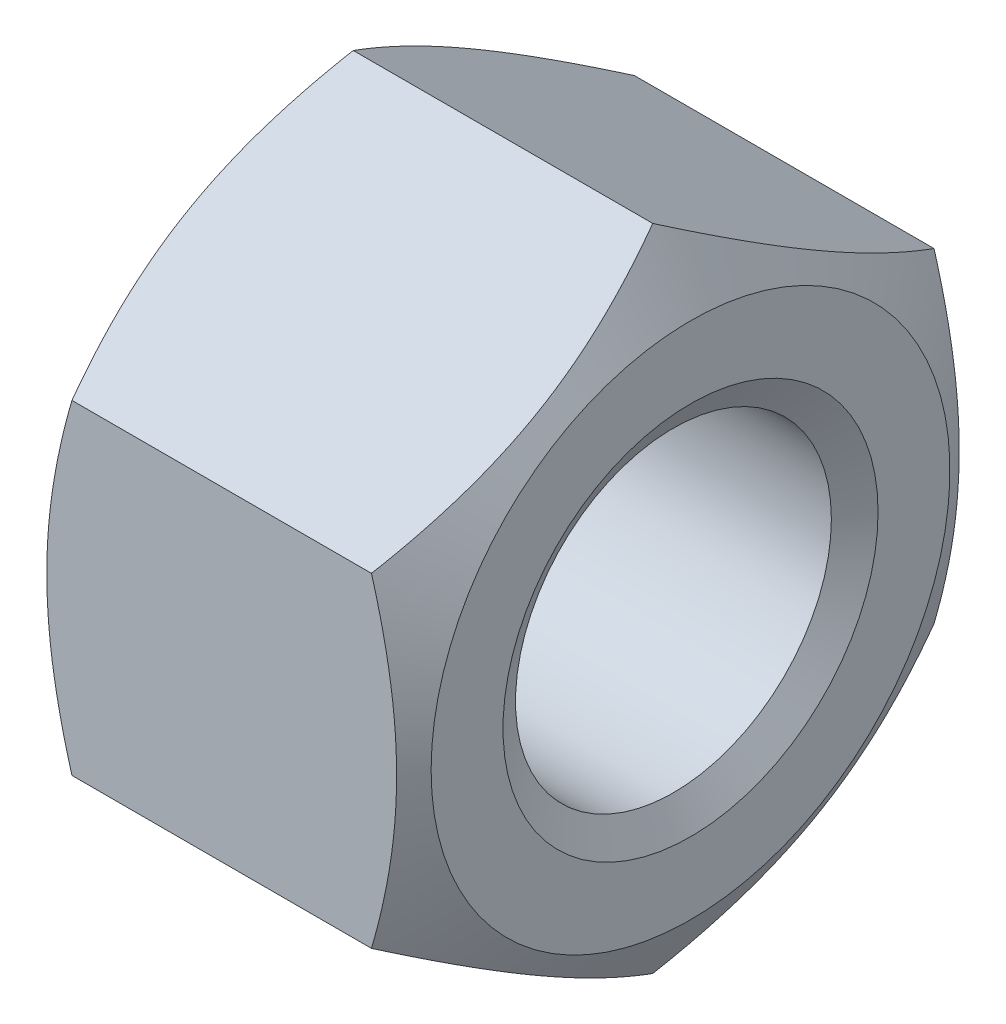
ISO-10303-21;
HEADER;
FILE_DESCRIPTION(('STEP AP214'),'2;1');
FILE_NAME('part.step','',(''),(''),'','','');
FILE_SCHEMA(('AUTOMOTIVE_DESIGN { 1 0 10303 214 1 1 1 1 }'));
ENDSEC;
DATA;
#1=APPLICATION_CONTEXT('core data for automotive mechanical design processes');
#2=APPLICATION_PROTOCOL_DEFINITION('international standard','automotive_design',2000,#1);
#3=PRODUCT_CONTEXT('',#1,'mechanical');
#4=PRODUCT('Part','Part','',(#3));
#5=PRODUCT_RELATED_PRODUCT_CATEGORY('part','',(#4));
#6=PRODUCT_DEFINITION_FORMATION('','',#4);
#7=PRODUCT_DEFINITION_CONTEXT('part definition',#1,'design');
#8=PRODUCT_DEFINITION('design','',#6,#7);
#9=PRODUCT_DEFINITION_SHAPE('','',#8);
#10=(LENGTH_UNIT() NAMED_UNIT(*) SI_UNIT(.MILLI.,.METRE.));
#11=(NAMED_UNIT(*) PLANE_ANGLE_UNIT() SI_UNIT($,.RADIAN.));
#12=(NAMED_UNIT(*) SI_UNIT($,.STERADIAN.) SOLID_ANGLE_UNIT());
#13=UNCERTAINTY_MEASURE_WITH_UNIT(LENGTH_MEASURE(1.E-05),#10,'distance_accuracy_value','');
#14=(GEOMETRIC_REPRESENTATION_CONTEXT(3) GLOBAL_UNCERTAINTY_ASSIGNED_CONTEXT((#13)) GLOBAL_UNIT_ASSIGNED_CONTEXT((#10,
#11,#12)) REPRESENTATION_CONTEXT('',''));
#15=CARTESIAN_POINT('',(0.,0.,0.));
#16=DIRECTION('',(0.,0.,1.));
#17=DIRECTION('',(1.,0.,0.));
#18=AXIS2_PLACEMENT_3D('',#15,#16,#17);
#19=CARTESIAN_POINT('',(0.,-5.19615242270663,9.));
#20=DIRECTION('',(0.,0.,1.));
#21=DIRECTION('',(1.,0.,0.));
#22=AXIS2_PLACEMENT_3D('',#19,#20,#21);
#23=PLANE('',#22);
#24=CARTESIAN_POINT('',(10.7920072006407,5.19615244908284,8.99999996280755));
#25=CARTESIAN_POINT('',(10.8579367021205,4.96774649350098,8.9999999866398));
#26=CARTESIAN_POINT('',(10.9208744760254,4.73844967700771,8.99999999641917));
#27=CARTESIAN_POINT('',(11.0399411197966,4.27799396747798,9.00000000358237));
#28=CARTESIAN_POINT('',(11.0960670506353,4.04683431625193,9.00000000096087));
#29=CARTESIAN_POINT('',(11.2007491843032,3.58222407504139,8.99999999903686));
#30=CARTESIAN_POINT('',(11.2492872997138,3.34876937968299,8.99999999974216));
#31=CARTESIAN_POINT('',(11.337743344119,2.88027225541252,9.00000000025777));
#32=CARTESIAN_POINT('',(11.3776630341332,2.6452301609984,9.00000000006827));
#33=CARTESIAN_POINT('',(11.4471978692115,2.17951731166322,8.9999999999334));
#34=CARTESIAN_POINT('',(11.4770419920115,1.94888095311327,8.99999999998215));
#35=CARTESIAN_POINT('',(11.5270801162313,1.48657638278532,9.00000000001784));
#36=CARTESIAN_POINT('',(11.5472749702592,1.25490826399993,9.00000000000477));
#37=CARTESIAN_POINT('',(11.5775101246048,0.791170290792557,8.99999999999523));
#38=CARTESIAN_POINT('',(11.5875619477008,0.559101192927458,8.99999999999872));
#39=CARTESIAN_POINT('',(11.5972935688812,0.0947495491293795,9.00000000000127));
#40=CARTESIAN_POINT('',(11.5969736875073,-0.137532989985249,9.00000000000031));
#41=CARTESIAN_POINT('',(11.5866846794573,-0.571777162862449,8.99999999999972));
#42=CARTESIAN_POINT('',(11.577970648293,-0.773769446121166,8.99999999999992));
#43=CARTESIAN_POINT('',(11.5528689081992,-1.17728085842589,9.00000000000007));
#44=CARTESIAN_POINT('',(11.5364806821399,-1.37879995466608,9.00000000000002));
#45=CARTESIAN_POINT('',(11.4761920643437,-1.98257705214849,8.99999999999994));
#46=CARTESIAN_POINT('',(11.421175262668,-2.38376637535587,8.99999999999998));
#47=CARTESIAN_POINT('',(11.2836351513656,-3.19040010074397,9.00000000000001));
#48=CARTESIAN_POINT('',(11.2005289331518,-3.5957415794054,9.00000000000001));
#49=CARTESIAN_POINT('',(11.0119132505929,-4.40038055523603,8.99999999999999));
#50=CARTESIAN_POINT('',(10.9064480744569,-4.79968835292957,8.99999999999998));
#51=CARTESIAN_POINT('',(10.7920072577196,-5.19615233570631,9.));
#52=B_SPLINE_CURVE_WITH_KNOTS('',3,(#24,#25,#26,#27,#28,#29,#30,#31,#32,#33,#34,#35,#36,#37,#38,
#39,#40,#41,#42,#43,#44,#45,#46,#47,#48,#49,#50,#51),.UNSPECIFIED.,.F.,.F.,(4,2,2,2,2,2,2,2,2,2,
2,2,2,4),(0.,0.713211353556727,1.42672934244264,2.14192306043958,2.85697050292028,
3.55445831583902,4.25188448742953,4.94851746757656,5.64512891802083,6.25151818008027,
6.85794830989732,8.07167213792062,9.31231054455676,10.5505141021013),.UNSPECIFIED.);
#53=CARTESIAN_POINT('',(10.7920072451693,5.19615244446898,8.9999999623065));
#54=VERTEX_POINT('',#53);
#55=CARTESIAN_POINT('',(10.7920072451693,-5.19615237918194,9.));
#56=VERTEX_POINT('',#55);
#57=EDGE_CURVE('E92',#54,#56,#52,.T.);
#58=ORIENTED_EDGE('',*,*,#57,.F.);
#59=DIRECTION('',(1.,0.,0.));
#60=VECTOR('',#59,1.);
#61=CARTESIAN_POINT('',(0.,5.19615242270663,8.99999999999999));
#62=LINE('',#61,#60);
#63=CARTESIAN_POINT('',(1.2079927548307,5.19615237918194,8.99999999999999));
#64=VERTEX_POINT('',#63);
#65=EDGE_CURVE('E80',#64,#54,#62,.T.);
#66=ORIENTED_EDGE('',*,*,#65,.F.);
#67=CARTESIAN_POINT('',(1.20799274207979,-5.19615233571104,9.00000000030846));
#68=CARTESIAN_POINT('',(1.14206325693808,-4.96774637828837,9.0000000001108));
#69=CARTESIAN_POINT('',(1.07912549077972,-4.73844956232251,9.00000000002969));
#70=CARTESIAN_POINT('',(0.96005885488113,-4.2779938558541,8.99999999997029));
#71=CARTESIAN_POINT('',(0.903932924168471,-4.04683420716203,8.99999999999203));
#72=CARTESIAN_POINT('',(0.799250792738206,-3.58222397040238,9.00000000000798));
#73=CARTESIAN_POINT('',(0.750712679447752,-3.34876927695885,9.00000000000214));
#74=CARTESIAN_POINT('',(0.662256638698184,-2.88027215676435,8.99999999999786));
#75=CARTESIAN_POINT('',(0.622336950218165,-2.64523006451157,8.99999999999943));
#76=CARTESIAN_POINT('',(0.552802118192762,-2.1795172191884,9.00000000000055));
#77=CARTESIAN_POINT('',(0.522957996920903,-1.94888086248689,9.00000000000014));
#78=CARTESIAN_POINT('',(0.472919875623132,-1.48657629590395,8.99999999999985));
#79=CARTESIAN_POINT('',(0.45272502299022,-1.25490817901504,8.99999999999996));
#80=CARTESIAN_POINT('',(0.42248987131652,-0.791170209704866,9.00000000000004));
#81=CARTESIAN_POINT('',(0.412438049495434,-0.559101113840569,9.00000000000001));
#82=CARTESIAN_POINT('',(0.402706430692705,-0.0947494741110776,8.99999999999999));
#83=CARTESIAN_POINT('',(0.403026313168858,0.137533062935757,8.99999999999999));
#84=CARTESIAN_POINT('',(0.41331532307057,0.571777230881825,9.));
#85=CARTESIAN_POINT('',(0.422029354968696,0.77376951128332,9.));
#86=CARTESIAN_POINT('',(0.447131096290837,1.17728091785728,9.));
#87=CARTESIAN_POINT('',(0.463519322844663,1.37880001122393,9.));
#88=CARTESIAN_POINT('',(0.523807941769657,1.98257710012436,9.));
#89=CARTESIAN_POINT('',(0.578824743722306,2.38376641762015,9.));
#90=CARTESIAN_POINT('',(0.716364854652097,3.19040013112921,9.));
#91=CARTESIAN_POINT('',(0.799471072168504,3.5957416036305,9.));
#92=CARTESIAN_POINT('',(0.988086752580254,4.40038056724764,9.));
#93=CARTESIAN_POINT('',(1.09355192726476,4.79968835888825,9.));
#94=CARTESIAN_POINT('',(1.20799274228037,5.19615233570631,9.));
#95=B_SPLINE_CURVE_WITH_KNOTS('',3,(#67,#68,#69,#70,#71,#72,#73,#74,#75,#76,#77,#78,#79,#80,#81,
#82,#83,#84,#85,#86,#87,#88,#89,#90,#91,#92,#93,#94),.UNSPECIFIED.,.F.,.F.,(4,2,2,2,2,2,2,2,2,2,
2,2,2,4),(0.,0.713211345889914,1.42672932744395,2.14192303843818,2.8569704737925,
3.55445828061228,4.251884446179,4.94851742016712,5.64512886441926,6.251518118017,
6.85794823936803,8.07167205058462,9.31231043873204,10.5505139776507),.UNSPECIFIED.);
#96=CARTESIAN_POINT('',(1.20799277213881,-5.19615241449045,9.00000001423084));
#97=VERTEX_POINT('',#96);
#98=EDGE_CURVE('E240',#97,#64,#95,.T.);
#99=ORIENTED_EDGE('',*,*,#98,.F.);
#100=DIRECTION('',(1.,0.,0.));
#101=VECTOR('',#100,1.);
#102=CARTESIAN_POINT('',(0.,-5.19615242270663,9.));
#103=LINE('',#102,#101);
#104=EDGE_CURVE('E95',#56,#97,#103,.F.);
#105=ORIENTED_EDGE('',*,*,#104,.F.);
#106=EDGE_LOOP('',(#58,#66,#99,#105));
#107=FACE_BOUND('',#106,.T.);
#108=ADVANCED_FACE('F17',(#107),#23,.T.);
#109=CARTESIAN_POINT('',(0.,5.19615242270663,9.));
#110=DIRECTION('',(0.,0.866025403784438,0.500000000000001));
#111=DIRECTION('',(0.,-0.500000000000001,0.866025403784438));
#112=AXIS2_PLACEMENT_3D('',#109,#110,#111);
#113=PLANE('',#112);
#114=CARTESIAN_POINT('',(10.7920072579202,10.3923048021826,7.54946300749363E-08));
#115=CARTESIAN_POINT('',(10.8579367430619,10.2781018233001,0.19780543689955));
#116=CARTESIAN_POINT('',(10.9208745092203,10.1634534152469,0.396382304492317));
#117=CARTESIAN_POINT('',(11.0399411451189,9.93322556196127,0.795148643581763));
#118=CARTESIAN_POINT('',(11.0960670758315,9.81764573763406,0.995338771689852));
#119=CARTESIAN_POINT('',(11.2007492072618,9.58534061926805,1.39770303958999));
#120=CARTESIAN_POINT('',(11.2492873205522,9.46861327254122,1.59988073474187));
#121=CARTESIAN_POINT('',(11.3377433613018,9.23436471244027,2.00561114242802));
#122=CARTESIAN_POINT('',(11.3776630497818,9.11684366631524,2.20916356527836));
#123=CARTESIAN_POINT('',(11.4471978818072,8.88398724365462,2.61248272019752));
#124=CARTESIAN_POINT('',(11.4770420030791,8.76866906530352,2.81221966413711));
#125=CARTESIAN_POINT('',(11.5270801243769,8.53751678201179,3.21258716308334));
#126=CARTESIAN_POINT('',(11.5472749770098,8.42168272356743,3.4132176375561));
#127=CARTESIAN_POINT('',(11.5775101286835,8.18981373891241,3.81482649967816));
#128=CARTESIAN_POINT('',(11.5875619505046,8.07377919098024,4.01580423212991));
#129=CARTESIAN_POINT('',(11.5972935693073,7.84160337111547,4.4179445484246));
#130=CARTESIAN_POINT('',(11.5969736868311,7.72546210259206,4.61910712636266));
#131=CARTESIAN_POINT('',(11.5866846769294,7.50834001861903,4.99517360724919));
#132=CARTESIAN_POINT('',(11.5779706450313,7.40734387841828,5.17010405344524));
#133=CARTESIAN_POINT('',(11.5528689037092,7.2055881751313,5.51955518225507));
#134=CARTESIAN_POINT('',(11.5364806771553,7.10482862844798,5.69407583645819));
#135=CARTESIAN_POINT('',(11.4761920582303,6.80294008399776,6.21696213366899));
#136=CARTESIAN_POINT('',(11.4211752562777,6.60234542524987,6.56440227434728));
#137=CARTESIAN_POINT('',(11.2836351453479,6.19902856849534,7.2629675617951));
#138=CARTESIAN_POINT('',(11.2005289278315,5.9963578322447,7.61400357418861));
#139=CARTESIAN_POINT('',(11.0119132474198,5.59403835043613,8.31084135755583));
#140=CARTESIAN_POINT('',(10.9064480727352,5.39438445461582,8.65665204904566));
#141=CARTESIAN_POINT('',(10.7920072577196,5.1961524662068,8.9999999246555));
#142=B_SPLINE_CURVE_WITH_KNOTS('',3,(#114,#115,#116,#117,#118,#119,#120,#121,#122,#123,#124,
#125,#126,#127,#128,#129,#130,#131,#132,#133,#134,#135,#136,#137,#138,#139,#140,#141),
.UNSPECIFIED.,.F.,.F.,(4,2,2,2,2,2,2,2,2,2,2,2,2,4),(0.,0.713211345889915,1.42672932744395,
2.14192303843818,2.85697047379251,3.55445828061228,4.251884446179,4.94851742016712,
5.64512886441926,6.251518118017,6.85794823936803,8.07167205058461,9.31231043873203,
10.5505139776507),.UNSPECIFIED.);
#143=CARTESIAN_POINT('',(10.7920072278612,10.3923048536294,1.42308406691086E-08));
#144=VERTEX_POINT('',#143);
#145=EDGE_CURVE('E21',#144,#54,#142,.T.);
#146=ORIENTED_EDGE('',*,*,#145,.F.);
#147=DIRECTION('',(1.,0.,0.));
#148=VECTOR('',#147,1.);
#149=CARTESIAN_POINT('',(0.,10.3923048454133,0.));
#150=LINE('',#149,#148);
#151=CARTESIAN_POINT('',(1.20799275483071,10.3923048236509,3.76934946545578E-08));
#152=VERTEX_POINT('',#151);
#153=EDGE_CURVE('E73',#152,#144,#150,.T.);
#154=ORIENTED_EDGE('',*,*,#153,.F.);
#155=CARTESIAN_POINT('',(1.20799279935926,5.19615237730893,9.00000000424624));
#156=CARTESIAN_POINT('',(1.14206329787952,5.31035537573919,8.80219465625281));
#157=CARTESIAN_POINT('',(1.07912552397457,5.42500379245501,8.60361779305241));
#158=CARTESIAN_POINT('',(0.960058880203377,5.65523165342339,8.20485145486368));
#159=CARTESIAN_POINT('',(0.903932949364721,5.77081147676613,8.00466132326123));
#160=CARTESIAN_POINT('',(0.799250815696802,6.00311659570516,7.60229705055248));
#161=CARTESIAN_POINT('',(0.750712700286224,6.11984394399517,7.400119354092));
#162=CARTESIAN_POINT('',(0.662256655880975,6.35409250657693,6.99438894313163));
#163=CARTESIAN_POINT('',(0.622336965866783,6.47161355361988,6.79083651831554));
#164=CARTESIAN_POINT('',(0.552802130788498,6.70446997817067,6.38751735985501));
#165=CARTESIAN_POINT('',(0.522958007988527,6.81978815748786,6.1877804143388));
#166=CARTESIAN_POINT('',(0.472919883768696,7.05094044268274,5.78741291216698));
#167=CARTESIAN_POINT('',(0.452725029740792,7.16677450206412,5.58678243604535));
#168=CARTESIAN_POINT('',(0.422489875395221,7.39864348865954,5.18517357054348));
#169=CARTESIAN_POINT('',(0.412438052299181,7.51467803759512,4.98419583636072));
#170=CARTESIAN_POINT('',(0.402706431118769,7.74685385949637,4.5820555165438));
#171=CARTESIAN_POINT('',(0.403026312492687,7.86299512905285,4.3808929368145));
#172=CARTESIAN_POINT('',(0.41331532054269,8.08011721549093,4.00482645165718));
#173=CARTESIAN_POINT('',(0.422029351707053,8.18111335712047,3.82989600298681));
#174=CARTESIAN_POINT('',(0.447131091800832,8.38286906327296,3.48044486921406));
#175=CARTESIAN_POINT('',(0.463519317860121,8.48362861139301,3.30592421252236));
#176=CARTESIAN_POINT('',(0.523807935656345,8.78551716013415,2.78303790787932));
#177=CARTESIAN_POINT('',(0.578824737332017,8.98611182173787,2.43559776225466));
#178=CARTESIAN_POINT('',(0.716364848634437,9.38942868443195,1.7370324645193));
#179=CARTESIAN_POINT('',(0.799471066848173,9.59209942376265,1.38599644679096));
#180=CARTESIAN_POINT('',(0.9880867494071,9.99441891167796,0.689158652846527));
#181=CARTESIAN_POINT('',(1.09355192554315,10.1940728105247,0.343347956114703));
#182=CARTESIAN_POINT('',(1.20799274228037,10.3923048019131,7.53445016527516E-08));
#183=B_SPLINE_CURVE_WITH_KNOTS('',3,(#155,#156,#157,#158,#159,#160,#161,#162,#163,#164,#165,
#166,#167,#168,#169,#170,#171,#172,#173,#174,#175,#176,#177,#178,#179,#180,#181,#182),
.UNSPECIFIED.,.F.,.F.,(4,2,2,2,2,2,2,2,2,2,2,2,2,4),(0.,0.713211353556726,1.42672934244264,
2.14192306043958,2.85697050292028,3.55445831583902,4.25188448742953,4.94851746757656,
5.64512891802083,6.25151818008027,6.85794830989732,8.07167213792061,9.31231054455675,
10.5505141021013),.UNSPECIFIED.);
#184=EDGE_CURVE('E83',#64,#152,#183,.T.);
#185=ORIENTED_EDGE('',*,*,#184,.F.);
#186=ORIENTED_EDGE('',*,*,#65,.T.);
#187=EDGE_LOOP('',(#146,#154,#185,#186));
#188=FACE_BOUND('',#187,.T.);
#189=ADVANCED_FACE('F82',(#188),#113,.T.);
#190=CARTESIAN_POINT('',(0.,10.3923048454133,0.));
#191=DIRECTION('',(0.,0.866025403784439,-0.499999999999999));
#192=DIRECTION('',(0.,0.499999999999999,0.866025403784439));
#193=AXIS2_PLACEMENT_3D('',#190,#191,#192);
#194=PLANE('',#193);
#195=CARTESIAN_POINT('',(10.7920072006407,5.19615237730895,-9.00000000424623));
#196=CARTESIAN_POINT('',(10.8579367021258,5.31035537574843,-8.80219465623683));
#197=CARTESIAN_POINT('',(10.9208744760356,5.42500379247355,-8.60361779302033));
#198=CARTESIAN_POINT('',(11.0399411198153,5.65523165346068,-8.20485145479911));
#199=CARTESIAN_POINT('',(11.0960670506576,5.77081147681288,-8.00466132318027));
#200=CARTESIAN_POINT('',(11.2007491843321,6.00311659577217,-7.60229705043644));
#201=CARTESIAN_POINT('',(11.2492872997454,6.11984394407298,-7.40011935395725));
#202=CARTESIAN_POINT('',(11.3377433441544,6.35409250667648,-6.99438894295923));
#203=CARTESIAN_POINT('',(11.3776630341695,6.47161355373035,-6.79083651812422));
#204=CARTESIAN_POINT('',(11.4471978692417,6.70446997828266,-6.38751735966105));
#205=CARTESIAN_POINT('',(11.4770419920363,6.81978815759033,-6.18778041416133));
#206=CARTESIAN_POINT('',(11.5270801162467,7.05094044276603,-5.78741291202273));
#207=CARTESIAN_POINT('',(11.5472749702707,7.16677450213776,-5.58678243591783));
#208=CARTESIAN_POINT('',(11.5775101246098,7.39864348871271,-5.18517357045141));
#209=CARTESIAN_POINT('',(11.5875619477035,7.51467803763747,-4.98419583628739));
#210=CARTESIAN_POINT('',(11.5972935688812,7.74685385951727,-4.5820555165076));
#211=CARTESIAN_POINT('',(11.596973687507,7.86299512906313,-4.3808929367967));
#212=CARTESIAN_POINT('',(11.5866846793432,8.08011721789683,-4.00482644749007));
#213=CARTESIAN_POINT('',(11.5779706478776,8.18111336193021,-3.8298959946561));
#214=CARTESIAN_POINT('',(11.5528689068211,8.38286907287596,-3.48044485258118));
#215=CARTESIAN_POINT('',(11.5364806801003,8.48362862338542,-3.3059241917509));
#216=CARTESIAN_POINT('',(11.4761920598119,8.78551717927527,-2.78303787472593));
#217=CARTESIAN_POINT('',(11.4211752557986,8.98611184560422,-2.43559772091694));
#218=CARTESIAN_POINT('',(11.2836351386658,9.38942871785636,-1.73703240662651));
#219=CARTESIAN_POINT('',(11.2005289169171,9.59209946201516,-1.38599638053566));
#220=CARTESIAN_POINT('',(11.0119132265195,9.99441895941098,-0.689158570170494));
#221=CARTESIAN_POINT('',(10.9064480460844,10.1940728629108,-0.343347865379342));
#222=CARTESIAN_POINT('',(10.7920072248252,10.3923048588879,2.33387594313233E-08));
#223=B_SPLINE_CURVE_WITH_KNOTS('',3,(#195,#196,#197,#198,#199,#200,#201,#202,#203,#204,#205,
#206,#207,#208,#209,#210,#211,#212,#213,#214,#215,#216,#217,#218,#219,#220,#221,#222),
.UNSPECIFIED.,.F.,.F.,(4,2,2,2,2,2,2,2,2,2,2,2,2,4),(0.,0.713211353614336,1.42672934255798,
2.14192306062003,2.85697050316579,3.55445831602579,4.25188448755768,4.94851746763938,
5.64512891802085,6.25151819451751,6.85794833877609,8.07167219576964,9.31231063288045,
10.5505142206676),.UNSPECIFIED.);
#224=CARTESIAN_POINT('',(10.7920072451693,5.19615237918196,-9.));
#225=VERTEX_POINT('',#224);
#226=EDGE_CURVE('E94',#225,#144,#223,.T.);
#227=ORIENTED_EDGE('',*,*,#226,.F.);
#228=DIRECTION('',(-1.,0.,0.));
#229=VECTOR('',#228,1.);
#230=CARTESIAN_POINT('',(0.,5.19615242270666,-9.));
#231=LINE('',#230,#229);
#232=CARTESIAN_POINT('',(1.20799275483071,5.196152444469,-8.9999999623065));
#233=VERTEX_POINT('',#232);
#234=EDGE_CURVE('E224',#233,#225,#231,.F.);
#235=ORIENTED_EDGE('',*,*,#234,.F.);
#236=CARTESIAN_POINT('',(1.20799279935927,10.3923048263918,4.14386846175832E-08));
#237=CARTESIAN_POINT('',(1.14206329787952,10.2781018692402,-0.197805330386988));
#238=CARTESIAN_POINT('',(1.07912552397457,10.1634534694627,-0.396382203366748));
#239=CARTESIAN_POINT('',(0.960058880203378,9.93322562090135,-0.795148548718683));
#240=CARTESIAN_POINT('',(0.903932949364723,9.81764579301805,-0.995338677699643));
#241=CARTESIAN_POINT('',(0.799250815696804,9.58534067074654,-1.39770294848439));
#242=CARTESIAN_POINT('',(0.750712700286226,9.46861332367815,-1.59988064565016));
#243=CARTESIAN_POINT('',(0.662256655880977,9.23436476198945,-2.00561105712615));
#244=CARTESIAN_POINT('',(0.622336965866786,9.11684371461827,-2.20916348175273));
#245=CARTESIAN_POINT('',(0.552802130788501,8.88398728983388,-2.61248264007839));
#246=CARTESIAN_POINT('',(0.522958007988529,8.76866911060113,-2.81221958564336));
#247=CARTESIAN_POINT('',(0.472919883768698,8.53751682546806,-3.21258708785086));
#248=CARTESIAN_POINT('',(0.452725029740794,8.42168276606405,-3.41321756395942));
#249=CARTESIAN_POINT('',(0.422489875395223,8.18981377945209,-3.81482642945174));
#250=CARTESIAN_POINT('',(0.412438052299182,8.07377923052258,-4.01580416363801));
#251=CARTESIAN_POINT('',(0.402706431118771,7.84160340862574,-4.41794448345748));
#252=CARTESIAN_POINT('',(0.403026312492689,7.7254621390676,-4.61910706318582));
#253=CARTESIAN_POINT('',(0.413315320542692,7.50834005262849,-4.99517354834254));
#254=CARTESIAN_POINT('',(0.422029351707055,7.4073439109993,-5.17010399701311));
#255=CARTESIAN_POINT('',(0.447131091800834,7.20558820484707,-5.51955513078601));
#256=CARTESIAN_POINT('',(0.463519317860123,7.10482865672694,-5.69407578747767));
#257=CARTESIAN_POINT('',(0.523807935656347,6.80294010798567,-6.21696209212063));
#258=CARTESIAN_POINT('',(0.578824737332018,6.60234544638201,-6.56440223774532));
#259=CARTESIAN_POINT('',(0.716364848634437,6.19902858368799,-7.26296753548071));
#260=CARTESIAN_POINT('',(0.799471066848173,5.99635784435727,-7.61400355320905));
#261=CARTESIAN_POINT('',(0.9880867494071,5.59403835644194,-8.31084134715346));
#262=CARTESIAN_POINT('',(1.09355192554315,5.39438445759517,-8.65665204388528));
#263=CARTESIAN_POINT('',(1.20799274228037,5.19615246620682,-8.99999992465549));
#264=B_SPLINE_CURVE_WITH_KNOTS('',3,(#236,#237,#238,#239,#240,#241,#242,#243,#244,#245,#246,
#247,#248,#249,#250,#251,#252,#253,#254,#255,#256,#257,#258,#259,#260,#261,#262,#263),
.UNSPECIFIED.,.F.,.F.,(4,2,2,2,2,2,2,2,2,2,2,2,2,4),(0.,0.713211353556727,1.42672934244264,
2.14192306043958,2.85697050292028,3.55445831583902,4.25188448742953,4.94851746757656,
5.64512891802083,6.25151818008027,6.85794830989731,8.07167213792061,9.31231054455674,
10.5505141021013),.UNSPECIFIED.);
#265=EDGE_CURVE('E162',#152,#233,#264,.T.);
#266=ORIENTED_EDGE('',*,*,#265,.F.);
#267=ORIENTED_EDGE('',*,*,#153,.T.);
#268=EDGE_LOOP('',(#227,#235,#266,#267));
#269=FACE_BOUND('',#268,.T.);
#270=ADVANCED_FACE('F170',(#269),#194,.T.);
#271=CARTESIAN_POINT('',(0.,5.19615242270665,-9.));
#272=DIRECTION('',(0.,0.,-1.));
#273=DIRECTION('',(-1.,0.,0.));
#274=AXIS2_PLACEMENT_3D('',#271,#272,#273);
#275=PLANE('',#274);
#276=CARTESIAN_POINT('',(10.7920072006408,-5.1961524490828,-8.99999996280757));
#277=CARTESIAN_POINT('',(10.8579367021205,-4.96774649350094,-8.99999998663981));
#278=CARTESIAN_POINT('',(10.9208744760254,-4.73844967700766,-8.99999999641917));
#279=CARTESIAN_POINT('',(11.0399411197966,-4.27799396747793,-9.00000000358237));
#280=CARTESIAN_POINT('',(11.0960670506353,-4.04683431625189,-9.00000000096087));
#281=CARTESIAN_POINT('',(11.2007491843032,-3.58222407504135,-8.99999999903687));
#282=CARTESIAN_POINT('',(11.2492872997138,-3.34876937968295,-8.99999999974217));
#283=CARTESIAN_POINT('',(11.337743344119,-2.88027225541249,-9.00000000025778));
#284=CARTESIAN_POINT('',(11.3776630341332,-2.64523016099836,-9.00000000006827));
#285=CARTESIAN_POINT('',(11.4471978692115,-2.17951731166318,-8.9999999999334));
#286=CARTESIAN_POINT('',(11.4770419920115,-1.94888095311324,-8.99999999998216));
#287=CARTESIAN_POINT('',(11.5270801162313,-1.48657638278528,-9.00000000001784));
#288=CARTESIAN_POINT('',(11.5472749702592,-1.2549082639999,-9.00000000000478));
#289=CARTESIAN_POINT('',(11.5775101246048,-0.791170290792524,-8.99999999999523));
#290=CARTESIAN_POINT('',(11.5875619477008,-0.559101192927425,-8.99999999999873));
#291=CARTESIAN_POINT('',(11.5972935688812,-0.0947495491293478,-9.00000000000127));
#292=CARTESIAN_POINT('',(11.5969736875073,0.13753298998528,-9.00000000000032));
#293=CARTESIAN_POINT('',(11.5866846794573,0.571777162862478,-8.99999999999972));
#294=CARTESIAN_POINT('',(11.5779706482929,0.773769446121195,-8.99999999999993));
#295=CARTESIAN_POINT('',(11.5528689081992,1.17728085842592,-9.00000000000008));
#296=CARTESIAN_POINT('',(11.5364806821399,1.3787999546661,-9.00000000000003));
#297=CARTESIAN_POINT('',(11.4761920643437,1.98257705214851,-8.99999999999995));
#298=CARTESIAN_POINT('',(11.421175262668,2.38376637535589,-8.99999999999999));
#299=CARTESIAN_POINT('',(11.2836351513656,3.19040010074399,-9.00000000000002));
#300=CARTESIAN_POINT('',(11.2005289331518,3.59574157940541,-9.00000000000001));
#301=CARTESIAN_POINT('',(11.0119132505929,4.40038055523604,-8.99999999999999));
#302=CARTESIAN_POINT('',(10.9064480744568,4.79968835292958,-8.99999999999999));
#303=CARTESIAN_POINT('',(10.7920072577196,5.19615233570631,-9.));
#304=B_SPLINE_CURVE_WITH_KNOTS('',3,(#276,#277,#278,#279,#280,#281,#282,#283,#284,#285,#286,
#287,#288,#289,#290,#291,#292,#293,#294,#295,#296,#297,#298,#299,#300,#301,#302,#303),
.UNSPECIFIED.,.F.,.F.,(4,2,2,2,2,2,2,2,2,2,2,2,2,4),(0.,0.713211353556724,1.42672934244264,
2.14192306043957,2.85697050292027,3.55445831583901,4.25188448742952,4.94851746757655,
5.64512891802082,6.25151818008025,6.8579483098973,8.07167213792059,9.31231054455673,
10.5505141021013),.UNSPECIFIED.);
#305=CARTESIAN_POINT('',(10.7920072451693,-5.19615244446895,-8.99999996230654));
#306=VERTEX_POINT('',#305);
#307=EDGE_CURVE('E130',#306,#225,#304,.T.);
#308=ORIENTED_EDGE('',*,*,#307,.F.);
#309=DIRECTION('',(1.,0.,0.));
#310=VECTOR('',#309,1.);
#311=CARTESIAN_POINT('',(0.,-5.1961524227066,-9.00000000000003));
#312=LINE('',#311,#310);
#313=CARTESIAN_POINT('',(1.2079927548307,-5.1961523791819,-9.00000000000002));
#314=VERTEX_POINT('',#313);
#315=EDGE_CURVE('E226',#314,#306,#312,.T.);
#316=ORIENTED_EDGE('',*,*,#315,.F.);
#317=CARTESIAN_POINT('',(1.20799279935928,5.19615244908286,-8.99999996280756));
#318=CARTESIAN_POINT('',(1.14206329787953,4.967746493501,-8.99999998663981));
#319=CARTESIAN_POINT('',(1.07912552397458,4.73844967700772,-8.99999999641917));
#320=CARTESIAN_POINT('',(0.960058880203384,4.27799396747799,-9.00000000358237));
#321=CARTESIAN_POINT('',(0.903932949364729,4.04683431625195,-9.00000000096087));
#322=CARTESIAN_POINT('',(0.799250815696809,3.5822240750414,-8.99999999903687));
#323=CARTESIAN_POINT('',(0.750712700286231,3.34876937968301,-8.99999999974217));
#324=CARTESIAN_POINT('',(0.662256655880981,2.88027225541254,-9.00000000025778));
#325=CARTESIAN_POINT('',(0.622336965866789,2.64523016099841,-9.00000000006827));
#326=CARTESIAN_POINT('',(0.552802130788503,2.17951731166323,-8.9999999999334));
#327=CARTESIAN_POINT('',(0.522958007988531,1.94888095311329,-8.99999999998216));
#328=CARTESIAN_POINT('',(0.472919883768698,1.48657638278533,-9.00000000001784));
#329=CARTESIAN_POINT('',(0.452725029740794,1.25490826399995,-9.00000000000478));
#330=CARTESIAN_POINT('',(0.422489875395221,0.791170290792568,-8.99999999999523));
#331=CARTESIAN_POINT('',(0.412438052299181,0.559101192927469,-8.99999999999873));
#332=CARTESIAN_POINT('',(0.402706431118769,0.0947495491293892,-9.00000000000127));
#333=CARTESIAN_POINT('',(0.403026312492687,-0.13753298998524,-9.00000000000032));
#334=CARTESIAN_POINT('',(0.413315320542689,-0.571777162862438,-8.99999999999972));
#335=CARTESIAN_POINT('',(0.422029351707051,-0.773769446121155,-8.99999999999993));
#336=CARTESIAN_POINT('',(0.447131091800829,-1.17728085842588,-9.00000000000008));
#337=CARTESIAN_POINT('',(0.463519317860118,-1.37879995466606,-9.00000000000003));
#338=CARTESIAN_POINT('',(0.523807935656341,-1.98257705214847,-8.99999999999995));
#339=CARTESIAN_POINT('',(0.578824737332011,-2.38376637535585,-8.99999999999999));
#340=CARTESIAN_POINT('',(0.716364848634429,-3.19040010074394,-9.00000000000002));
#341=CARTESIAN_POINT('',(0.799471066848165,-3.59574157940537,-9.00000000000001));
#342=CARTESIAN_POINT('',(0.988086749407091,-4.400380555236,-8.99999999999999));
#343=CARTESIAN_POINT('',(1.09355192554314,-4.79968835292953,-8.99999999999999));
#344=CARTESIAN_POINT('',(1.20799274228036,-5.19615233570627,-9.));
#345=B_SPLINE_CURVE_WITH_KNOTS('',3,(#317,#318,#319,#320,#321,#322,#323,#324,#325,#326,#327,
#328,#329,#330,#331,#332,#333,#334,#335,#336,#337,#338,#339,#340,#341,#342,#343,#344),
.UNSPECIFIED.,.F.,.F.,(4,2,2,2,2,2,2,2,2,2,2,2,2,4),(0.,0.713211353556728,1.42672934244265,
2.14192306043958,2.85697050292028,3.55445831583903,4.25188448742954,4.94851746757657,
5.64512891802084,6.25151818008028,6.85794830989733,8.07167213792062,9.31231054455675,
10.5505141021013),.UNSPECIFIED.);
#346=EDGE_CURVE('E153',#233,#314,#345,.T.);
#347=ORIENTED_EDGE('',*,*,#346,.F.);
#348=ORIENTED_EDGE('',*,*,#234,.T.);
#349=EDGE_LOOP('',(#308,#316,#347,#348));
#350=FACE_BOUND('',#349,.T.);
#351=ADVANCED_FACE('F142',(#350),#275,.T.);
#352=CARTESIAN_POINT('',(0.,-5.19615242270661,-9.00000000000002));
#353=DIRECTION('',(0.,-0.866025403784438,-0.500000000000001));
#354=DIRECTION('',(0.,0.500000000000001,-0.866025403784438));
#355=AXIS2_PLACEMENT_3D('',#352,#353,#354);
#356=PLANE('',#355);
#357=CARTESIAN_POINT('',(10.7920072006407,-10.3923048263918,4.1438680187558E-08));
#358=CARTESIAN_POINT('',(10.8579367021205,-10.2781018692402,-0.197805330386993));
#359=CARTESIAN_POINT('',(10.9208744760254,-10.1634534694627,-0.396382203366753));
#360=CARTESIAN_POINT('',(11.0399411197966,-9.93322562090136,-0.795148548718686));
#361=CARTESIAN_POINT('',(11.0960670506353,-9.81764579301805,-0.995338677699645));
#362=CARTESIAN_POINT('',(11.2007491843032,-9.58534067074654,-1.39770294848439));
#363=CARTESIAN_POINT('',(11.2492872997138,-9.46861332367815,-1.59988064565016));
#364=CARTESIAN_POINT('',(11.337743344119,-9.23436476198945,-2.00561105712615));
#365=CARTESIAN_POINT('',(11.3776630341332,-9.11684371461827,-2.20916348175273));
#366=CARTESIAN_POINT('',(11.4471978692115,-8.88398728983388,-2.61248264007839));
#367=CARTESIAN_POINT('',(11.4770419920115,-8.76866911060113,-2.81221958564336));
#368=CARTESIAN_POINT('',(11.5270801162313,-8.53751682546805,-3.21258708785086));
#369=CARTESIAN_POINT('',(11.5472749702592,-8.42168276606404,-3.41321756395942));
#370=CARTESIAN_POINT('',(11.5775101246048,-8.18981377945209,-3.81482642945174));
#371=CARTESIAN_POINT('',(11.5875619477008,-8.07377923052257,-4.01580416363801));
#372=CARTESIAN_POINT('',(11.5972935688812,-7.84160340862573,-4.41794448345748));
#373=CARTESIAN_POINT('',(11.5969736875073,-7.72546213906759,-4.61910706318582));
#374=CARTESIAN_POINT('',(11.5866846794573,-7.50834005262847,-4.99517354834254));
#375=CARTESIAN_POINT('',(11.577970648293,-7.40734391099929,-5.17010399701311));
#376=CARTESIAN_POINT('',(11.5528689081992,-7.20558820484706,-5.51955513078602));
#377=CARTESIAN_POINT('',(11.5364806821399,-7.10482865672692,-5.69407578747768));
#378=CARTESIAN_POINT('',(11.4761920643437,-6.80294010798564,-6.21696209212064));
#379=CARTESIAN_POINT('',(11.421175262668,-6.60234544638199,-6.56440223774534));
#380=CARTESIAN_POINT('',(11.2836351513656,-6.19902858368796,-7.26296753548073));
#381=CARTESIAN_POINT('',(11.2005289331518,-5.99635784435724,-7.61400355320907));
#382=CARTESIAN_POINT('',(11.0119132505929,-5.5940383564419,-8.31084134715349));
#383=CARTESIAN_POINT('',(10.9064480744568,-5.39438445759512,-8.65665204388531));
#384=CARTESIAN_POINT('',(10.7920072577196,-5.19615246620677,-8.99999992465553));
#385=B_SPLINE_CURVE_WITH_KNOTS('',3,(#357,#358,#359,#360,#361,#362,#363,#364,#365,#366,#367,
#368,#369,#370,#371,#372,#373,#374,#375,#376,#377,#378,#379,#380,#381,#382,#383,#384),
.UNSPECIFIED.,.F.,.F.,(4,2,2,2,2,2,2,2,2,2,2,2,2,4),(0.,0.713211353556725,1.42672934244264,
2.14192306043958,2.85697050292028,3.55445831583902,4.25188448742953,4.94851746757656,
5.64512891802083,6.25151818008028,6.85794830989733,8.07167213792063,9.31231054455678,
10.5505141021013),.UNSPECIFIED.);
#386=CARTESIAN_POINT('',(10.7920072451693,-10.3923048236509,3.76934902786401E-08));
#387=VERTEX_POINT('',#386);
#388=EDGE_CURVE('E98',#387,#306,#385,.T.);
#389=ORIENTED_EDGE('',*,*,#388,.F.);
#390=DIRECTION('',(1.,0.,0.));
#391=VECTOR('',#390,1.);
#392=CARTESIAN_POINT('',(0.,-10.3923048454133,0.));
#393=LINE('',#392,#391);
#394=CARTESIAN_POINT('',(1.2079927548307,-10.3923048236509,-3.76934980946479E-08));
#395=VERTEX_POINT('',#394);
#396=EDGE_CURVE('E228',#395,#387,#393,.T.);
#397=ORIENTED_EDGE('',*,*,#396,.F.);
#398=CARTESIAN_POINT('',(1.20799279935928,-5.1961523773089,-9.00000000424627));
#399=CARTESIAN_POINT('',(1.14206329787953,-5.31035537573916,-8.80219465625284));
#400=CARTESIAN_POINT('',(1.07912552397458,-5.42500379245498,-8.60361779305245));
#401=CARTESIAN_POINT('',(0.960058880203383,-5.65523165342336,-8.20485145486371));
#402=CARTESIAN_POINT('',(0.903932949364727,-5.7708114767661,-8.00466132326126));
#403=CARTESIAN_POINT('',(0.799250815696807,-6.00311659570514,-7.60229705055251));
#404=CARTESIAN_POINT('',(0.750712700286229,-6.11984394399514,-7.40011935409203));
#405=CARTESIAN_POINT('',(0.662256655880979,-6.35409250657691,-6.99438894313166));
#406=CARTESIAN_POINT('',(0.622336965866787,-6.47161355361985,-6.79083651831557));
#407=CARTESIAN_POINT('',(0.5528021307885,-6.70446997817064,-6.38751735985504));
#408=CARTESIAN_POINT('',(0.522958007988528,-6.81978815748784,-6.18778041433883));
#409=CARTESIAN_POINT('',(0.472919883768696,-7.05094044268272,-5.78741291216701));
#410=CARTESIAN_POINT('',(0.452725029740792,-7.1667745020641,-5.58678243604538));
#411=CARTESIAN_POINT('',(0.422489875395219,-7.39864348865952,-5.18517357054351));
#412=CARTESIAN_POINT('',(0.412438052299178,-7.5146780375951,-4.98419583636075));
#413=CARTESIAN_POINT('',(0.402706431118765,-7.74685385949634,-4.58205551654382));
#414=CARTESIAN_POINT('',(0.403026312492683,-7.86299512905283,-4.38089293681452));
#415=CARTESIAN_POINT('',(0.413315320542686,-8.08011721549092,-4.00482645165721));
#416=CARTESIAN_POINT('',(0.422029351707049,-8.18111335712045,-3.82989600298684));
#417=CARTESIAN_POINT('',(0.447131091800827,-8.38286906327294,-3.48044486921409));
#418=CARTESIAN_POINT('',(0.463519317860115,-8.48362861139299,-3.30592421252238));
#419=CARTESIAN_POINT('',(0.523807935656339,-8.78551716013413,-2.78303790787934));
#420=CARTESIAN_POINT('',(0.57882473733201,-8.98611182173786,-2.43559776225468));
#421=CARTESIAN_POINT('',(0.716364848634429,-9.38942868443193,-1.73703246451932));
#422=CARTESIAN_POINT('',(0.799471066848166,-9.59209942376264,-1.38599644679097));
#423=CARTESIAN_POINT('',(0.988086749407094,-9.99441891167795,-0.689158652846536));
#424=CARTESIAN_POINT('',(1.09355192554315,-10.1940728105247,-0.34334795611471));
#425=CARTESIAN_POINT('',(1.20799274228037,-10.3923048019131,-7.53445088029443E-08));
#426=B_SPLINE_CURVE_WITH_KNOTS('',3,(#398,#399,#400,#401,#402,#403,#404,#405,#406,#407,#408,
#409,#410,#411,#412,#413,#414,#415,#416,#417,#418,#419,#420,#421,#422,#423,#424,#425),
.UNSPECIFIED.,.F.,.F.,(4,2,2,2,2,2,2,2,2,2,2,2,2,4),(0.,0.713211353556728,1.42672934244265,
2.14192306043959,2.85697050292028,3.55445831583902,4.25188448742954,4.94851746757657,
5.64512891802084,6.25151818008028,6.85794830989733,8.07167213792063,9.31231054455677,
10.5505141021013),.UNSPECIFIED.);
#427=EDGE_CURVE('E40',#314,#395,#426,.T.);
#428=ORIENTED_EDGE('',*,*,#427,.F.);
#429=ORIENTED_EDGE('',*,*,#315,.T.);
#430=EDGE_LOOP('',(#389,#397,#428,#429));
#431=FACE_BOUND('',#430,.T.);
#432=ADVANCED_FACE('F139',(#431),#356,.T.);
#433=CARTESIAN_POINT('',(0.,-10.3923048454133,0.));
#434=DIRECTION('',(0.,-0.866025403784439,0.5));
#435=DIRECTION('',(0.,-0.5,-0.866025403784439));
#436=AXIS2_PLACEMENT_3D('',#433,#434,#435);
#437=PLANE('',#436);
#438=CARTESIAN_POINT('',(10.7920072006407,-5.19615237730893,9.00000000424624));
#439=CARTESIAN_POINT('',(10.8579367021205,-5.31035537573919,8.80219465625281));
#440=CARTESIAN_POINT('',(10.9208744760254,-5.42500379245501,8.60361779305242));
#441=CARTESIAN_POINT('',(11.0399411197966,-5.65523165342339,8.20485145486368));
#442=CARTESIAN_POINT('',(11.0960670506353,-5.77081147676613,8.00466132326123));
#443=CARTESIAN_POINT('',(11.2007491843032,-6.00311659570516,7.60229705055248));
#444=CARTESIAN_POINT('',(11.2492872997138,-6.11984394399517,7.400119354092));
#445=CARTESIAN_POINT('',(11.337743344119,-6.35409250657694,6.99438894313163));
#446=CARTESIAN_POINT('',(11.3776630341332,-6.47161355361988,6.79083651831554));
#447=CARTESIAN_POINT('',(11.4471978692115,-6.70446997817067,6.38751735985501));
#448=CARTESIAN_POINT('',(11.4770419920115,-6.81978815748786,6.18778041433879));
#449=CARTESIAN_POINT('',(11.5270801162313,-7.05094044268275,5.78741291216698));
#450=CARTESIAN_POINT('',(11.5472749702592,-7.16677450206412,5.58678243604535));
#451=CARTESIAN_POINT('',(11.5775101246048,-7.39864348865954,5.18517357054348));
#452=CARTESIAN_POINT('',(11.5875619477008,-7.51467803759512,4.98419583636072));
#453=CARTESIAN_POINT('',(11.5972935688812,-7.74685385949637,4.58205551654379));
#454=CARTESIAN_POINT('',(11.5969736875073,-7.86299512905285,4.38089293681449));
#455=CARTESIAN_POINT('',(11.5866846794573,-8.08011721549094,4.00482645165718));
#456=CARTESIAN_POINT('',(11.5779706482929,-8.18111335712047,3.82989600298681));
#457=CARTESIAN_POINT('',(11.5528689081992,-8.38286906327296,3.48044486921406));
#458=CARTESIAN_POINT('',(11.5364806821399,-8.48362861139301,3.30592421252235));
#459=CARTESIAN_POINT('',(11.4761920643437,-8.78551716013415,2.78303790787931));
#460=CARTESIAN_POINT('',(11.421175262668,-8.98611182173787,2.43559776225465));
#461=CARTESIAN_POINT('',(11.2836351513656,-9.38942868443194,1.7370324645193));
#462=CARTESIAN_POINT('',(11.2005289331518,-9.59209942376265,1.38599644679095));
#463=CARTESIAN_POINT('',(11.0119132505929,-9.99441891167796,0.68915865284652));
#464=CARTESIAN_POINT('',(10.9064480744569,-10.1940728105247,0.343347956114695));
#465=CARTESIAN_POINT('',(10.7920072577196,-10.3923048019131,7.53444935856292E-08));
#466=B_SPLINE_CURVE_WITH_KNOTS('',3,(#438,#439,#440,#441,#442,#443,#444,#445,#446,#447,#448,
#449,#450,#451,#452,#453,#454,#455,#456,#457,#458,#459,#460,#461,#462,#463,#464,#465),
.UNSPECIFIED.,.F.,.F.,(4,2,2,2,2,2,2,2,2,2,2,2,2,4),(0.,0.713211353556727,1.42672934244264,
2.14192306043958,2.85697050292028,3.55445831583902,4.25188448742953,4.94851746757656,
5.64512891802083,6.25151818008027,6.85794830989732,8.07167213792061,9.31231054455675,
10.5505141021013),.UNSPECIFIED.);
#467=EDGE_CURVE('E97',#56,#387,#466,.T.);
#468=ORIENTED_EDGE('',*,*,#467,.F.);
#469=ORIENTED_EDGE('',*,*,#104,.T.);
#470=CARTESIAN_POINT('',(1.20799279935927,-10.3923048263918,-4.14386883019775E-08));
#471=CARTESIAN_POINT('',(1.1420632978742,-10.2781018692309,0.197805330402962));
#472=CARTESIAN_POINT('',(1.07912552396441,-10.1634534694442,0.396382203398828));
#473=CARTESIAN_POINT('',(0.960058880184689,-9.93322562086408,0.795148548783248));
#474=CARTESIAN_POINT('',(0.903932949342355,-9.81764579297131,0.99533867778059));
#475=CARTESIAN_POINT('',(0.799250815667926,-9.58534067067955,1.39770294860042));
#476=CARTESIAN_POINT('',(0.750712700254598,-9.46861332360035,1.59988064578491));
#477=CARTESIAN_POINT('',(0.662256655845641,-9.23436476188992,2.00561105729854));
#478=CARTESIAN_POINT('',(0.622336965830489,-9.11684371450781,2.20916348194404));
#479=CARTESIAN_POINT('',(0.552802130758289,-8.8839872897219,2.61248264027235));
#480=CARTESIAN_POINT('',(0.522958007963741,-8.76866911049867,2.81221958582082));
#481=CARTESIAN_POINT('',(0.472919883753274,-8.53751682538478,3.2125870879951));
#482=CARTESIAN_POINT('',(0.452725029729313,-8.42168276599043,3.41321756408694));
#483=CARTESIAN_POINT('',(0.422489875390166,-8.18981377939894,3.81482642954381));
#484=CARTESIAN_POINT('',(0.412438052296511,-8.07377923048024,4.01580416371133));
#485=CARTESIAN_POINT('',(0.402706431118786,-7.84160340860485,4.41794448349366));
#486=CARTESIAN_POINT('',(0.403026312493043,-7.72546213905733,4.61910706320361));
#487=CARTESIAN_POINT('',(0.413315320656811,-7.5083400502226,4.99517355250964));
#488=CARTESIAN_POINT('',(0.42202935212241,-7.40734390618956,5.17010400534381));
#489=CARTESIAN_POINT('',(0.447131093178865,-7.20558819524407,5.51955514741889));
#490=CARTESIAN_POINT('',(0.463519319899661,-7.10482864473453,5.69407580824911));
#491=CARTESIAN_POINT('',(0.52380794018812,-6.80294008884455,6.21696212527401));
#492=CARTESIAN_POINT('',(0.578824744201427,-6.60234542251566,6.56440227908304));
#493=CARTESIAN_POINT('',(0.716364861334188,-6.19902855026357,7.26296759337349));
#494=CARTESIAN_POINT('',(0.799471083082898,-5.99635780610475,7.61400361946434));
#495=CARTESIAN_POINT('',(0.988086773480526,-5.5940383087089,8.31084142982949));
#496=CARTESIAN_POINT('',(1.09355195391563,-5.39438440520907,8.65665213462063));
#497=CARTESIAN_POINT('',(1.20799277517479,-5.196152409232,9.00000002333875));
#498=B_SPLINE_CURVE_WITH_KNOTS('',3,(#470,#471,#472,#473,#474,#475,#476,#477,#478,#479,#480,
#481,#482,#483,#484,#485,#486,#487,#488,#489,#490,#491,#492,#493,#494,#495,#496,#497),
.UNSPECIFIED.,.F.,.F.,(4,2,2,2,2,2,2,2,2,2,2,2,2,4),(0.,0.713211353614339,1.42672934255798,
2.14192306062003,2.85697050316579,3.55445831602579,4.25188448755768,4.94851746763938,
5.64512891802085,6.25151819451752,6.85794833877609,8.07167219576965,9.31231063288046,
10.5505142206676),.UNSPECIFIED.);
#499=EDGE_CURVE('E152',#395,#97,#498,.T.);
#500=ORIENTED_EDGE('',*,*,#499,.F.);
#501=ORIENTED_EDGE('',*,*,#396,.T.);
#502=EDGE_LOOP('',(#468,#469,#500,#501));
#503=FACE_BOUND('',#502,.T.);
#504=ADVANCED_FACE('F112',(#503),#437,.T.);
#505=CARTESIAN_POINT('',(10.7847592764127,0.,0.));
#506=DIRECTION('',(-1.,0.,0.));
#507=DIRECTION('',(0.,0.,1.));
#508=AXIS2_PLACEMENT_3D('',#505,#506,#507);
#509=CONICAL_SURFACE('',#508,10.4048586737543,1.04719755);
#510=CARTESIAN_POINT('',(12.0000000012518,0.,0.));
#511=DIRECTION('',(-1.,0.,0.));
#512=DIRECTION('',(0.,0.,1.));
#513=AXIS2_PLACEMENT_3D('',#510,#511,#512);
#514=CIRCLE('',#513,8.30000000072274);
#515=CARTESIAN_POINT('',(12.0000000012518,0.,8.30000000072274));
#516=VERTEX_POINT('',#515);
#517=EDGE_CURVE('E214',#516,#516,#514,.F.);
#518=ORIENTED_EDGE('',*,*,#517,.F.);
#519=EDGE_LOOP('',(#518));
#520=FACE_BOUND('',#519,.T.);
#521=ORIENTED_EDGE('',*,*,#307,.T.);
#522=ORIENTED_EDGE('',*,*,#226,.T.);
#523=ORIENTED_EDGE('',*,*,#145,.T.);
#524=ORIENTED_EDGE('',*,*,#57,.T.);
#525=ORIENTED_EDGE('',*,*,#467,.T.);
#526=ORIENTED_EDGE('',*,*,#388,.T.);
#527=EDGE_LOOP('',(#521,#522,#523,#524,#525,#526));
#528=FACE_BOUND('',#527,.T.);
#529=ADVANCED_FACE('F90',(#520,#528),#509,.T.);
#530=CARTESIAN_POINT('',(1.21524072358731,0.,0.));
#531=DIRECTION('',(1.,0.,0.));
#532=DIRECTION('',(0.,0.,-1.));
#533=AXIS2_PLACEMENT_3D('',#530,#531,#532);
#534=CONICAL_SURFACE('',#533,10.4048586737543,1.04719755);
#535=CARTESIAN_POINT('',(-1.25182286411785E-09,0.,0.));
#536=DIRECTION('',(1.,0.,0.));
#537=DIRECTION('',(0.,0.,-1.));
#538=AXIS2_PLACEMENT_3D('',#535,#536,#537);
#539=CIRCLE('',#538,8.30000000072274);
#540=CARTESIAN_POINT('',(-1.25182286411785E-09,0.,-8.30000000072274));
#541=VERTEX_POINT('',#540);
#542=EDGE_CURVE('E215',#541,#541,#539,.T.);
#543=ORIENTED_EDGE('',*,*,#542,.T.);
#544=EDGE_LOOP('',(#543));
#545=FACE_BOUND('',#544,.T.);
#546=ORIENTED_EDGE('',*,*,#427,.T.);
#547=ORIENTED_EDGE('',*,*,#499,.T.);
#548=ORIENTED_EDGE('',*,*,#98,.T.);
#549=ORIENTED_EDGE('',*,*,#184,.T.);
#550=ORIENTED_EDGE('',*,*,#265,.T.);
#551=ORIENTED_EDGE('',*,*,#346,.T.);
#552=EDGE_LOOP('',(#546,#547,#548,#549,#550,#551));
#553=FACE_BOUND('',#552,.T.);
#554=ADVANCED_FACE('F111',(#545,#553),#534,.T.);
#555=CARTESIAN_POINT('',(12.,0.,0.));
#556=DIRECTION('',(1.,0.,0.));
#557=DIRECTION('',(0.,0.,-1.));
#558=AXIS2_PLACEMENT_3D('',#555,#556,#557);
#559=PLANE('',#558);
#560=CARTESIAN_POINT('',(12.0000000005689,0.,0.));
#561=DIRECTION('',(1.,0.,0.));
#562=DIRECTION('',(0.,0.,-1.));
#563=AXIS2_PLACEMENT_3D('',#560,#561,#562);
#564=CIRCLE('',#563,6.00021528509842);
#565=CARTESIAN_POINT('',(12.0000000005689,0.,-6.00021528509842));
#566=VERTEX_POINT('',#565);
#567=EDGE_CURVE('E211',#566,#566,#564,.F.);
#568=ORIENTED_EDGE('',*,*,#567,.T.);
#569=EDGE_LOOP('',(#568));
#570=FACE_BOUND('',#569,.T.);
#571=ORIENTED_EDGE('',*,*,#517,.T.);
#572=EDGE_LOOP('',(#571));
#573=FACE_BOUND('',#572,.T.);
#574=ADVANCED_FACE('F200',(#570,#573),#559,.T.);
#575=CARTESIAN_POINT('',(0.,0.,0.));
#576=DIRECTION('',(1.,0.,0.));
#577=DIRECTION('',(0.,0.,-1.));
#578=AXIS2_PLACEMENT_3D('',#575,#576,#577);
#579=PLANE('',#578);
#580=CARTESIAN_POINT('',(-5.20384477430548E-10,0.,0.));
#581=DIRECTION('',(-1.,0.,0.));
#582=DIRECTION('',(0.,0.,1.));
#583=AXIS2_PLACEMENT_3D('',#580,#581,#582);
#584=CIRCLE('',#583,6.00021528504158);
#585=CARTESIAN_POINT('',(-5.20384477430548E-10,0.,6.00021528504158));
#586=VERTEX_POINT('',#585);
#587=EDGE_CURVE('E220',#586,#586,#584,.F.);
#588=ORIENTED_EDGE('',*,*,#587,.T.);
#589=EDGE_LOOP('',(#588));
#590=FACE_BOUND('',#589,.T.);
#591=ORIENTED_EDGE('',*,*,#542,.F.);
#592=EDGE_LOOP('',(#591));
#593=FACE_BOUND('',#592,.T.);
#594=ADVANCED_FACE('F197',(#590,#593),#579,.F.);
#595=CARTESIAN_POINT('',(12.0000000005689,0.,0.));
#596=DIRECTION('',(1.,0.,0.));
#597=DIRECTION('',(0.,0.,-1.));
#598=AXIS2_PLACEMENT_3D('',#595,#596,#597);
#599=CONICAL_SURFACE('',#598,6.00021528509842,1.04719754997565);
#600=ORIENTED_EDGE('',*,*,#567,.F.);
#601=EDGE_LOOP('',(#600));
#602=FACE_BOUND('',#601,.T.);
#603=CARTESIAN_POINT('',(11.453125,0.,0.));
#604=DIRECTION('',(1.,0.,0.));
#605=DIRECTION('',(0.,0.,-1.));
#606=AXIS2_PLACEMENT_3D('',#603,#604,#605);
#607=CIRCLE('',#606,5.053);
#608=CARTESIAN_POINT('',(11.453125,0.,-5.053));
#609=VERTEX_POINT('',#608);
#610=EDGE_CURVE('E31',#609,#609,#607,.F.);
#611=ORIENTED_EDGE('',*,*,#610,.T.);
#612=EDGE_LOOP('',(#611));
#613=FACE_BOUND('',#612,.T.);
#614=ADVANCED_FACE('F189',(#602,#613),#599,.F.);
#615=CARTESIAN_POINT('',(-4.54747350886464E-10,0.,0.));
#616=DIRECTION('',(-1.,0.,0.));
#617=DIRECTION('',(0.,0.,1.));
#618=AXIS2_PLACEMENT_3D('',#615,#616,#617);
#619=CONICAL_SURFACE('',#618,6.00021528492789,1.04719754999467);
#620=ORIENTED_EDGE('',*,*,#587,.F.);
#621=EDGE_LOOP('',(#620));
#622=FACE_BOUND('',#621,.T.);
#623=CARTESIAN_POINT('',(0.546874999999999,0.,0.));
#624=DIRECTION('',(1.,0.,0.));
#625=DIRECTION('',(0.,0.,-1.));
#626=AXIS2_PLACEMENT_3D('',#623,#624,#625);
#627=CIRCLE('',#626,5.053);
#628=CARTESIAN_POINT('',(0.546874999999999,0.,-5.053));
#629=VERTEX_POINT('',#628);
#630=EDGE_CURVE('E11',#629,#629,#627,.T.);
#631=ORIENTED_EDGE('',*,*,#630,.T.);
#632=EDGE_LOOP('',(#631));
#633=FACE_BOUND('',#632,.T.);
#634=ADVANCED_FACE('F183',(#622,#633),#619,.F.);
#635=CARTESIAN_POINT('',(-18.2383435416794,0.,0.));
#636=DIRECTION('',(1.,0.,0.));
#637=DIRECTION('',(0.,0.,-1.));
#638=AXIS2_PLACEMENT_3D('',#635,#636,#637);
#639=CYLINDRICAL_SURFACE('',#638,5.053);
#640=ORIENTED_EDGE('',*,*,#630,.F.);
#641=EDGE_LOOP('',(#640));
#642=FACE_BOUND('',#641,.T.);
#643=ORIENTED_EDGE('',*,*,#610,.F.);
#644=EDGE_LOOP('',(#643));
#645=FACE_BOUND('',#644,.T.);
#646=ADVANCED_FACE('F181',(#642,#645),#639,.F.);
#647=CLOSED_SHELL('',(#108,#189,#270,#351,#432,#504,#529,#554,#574,#594,#614,#634,#646));
#648=MANIFOLD_SOLID_BREP('B1',#647);
#649=ADVANCED_BREP_SHAPE_REPRESENTATION('',(#18,#648),#14);
#650=SHAPE_DEFINITION_REPRESENTATION(#9,#649);
ENDSEC;
END-ISO-10303-21;
